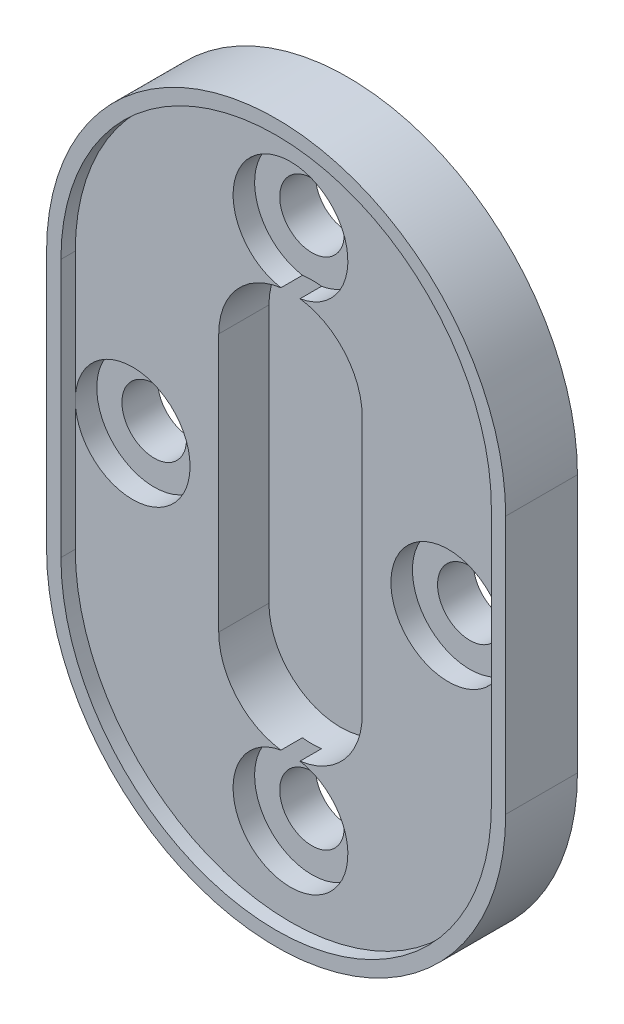
ISO-10303-21;
HEADER;
FILE_DESCRIPTION(('STEP AP214'),'2;1');
FILE_NAME('part.step','',(''),(''),'','','');
FILE_SCHEMA(('AUTOMOTIVE_DESIGN { 1 0 10303 214 1 1 1 1 }'));
ENDSEC;
DATA;
#1=APPLICATION_CONTEXT('core data for automotive mechanical design processes');
#2=APPLICATION_PROTOCOL_DEFINITION('international standard','automotive_design',2000,#1);
#3=PRODUCT_CONTEXT('',#1,'mechanical');
#4=PRODUCT('Part','Part','',(#3));
#5=PRODUCT_RELATED_PRODUCT_CATEGORY('part','',(#4));
#6=PRODUCT_DEFINITION_FORMATION('','',#4);
#7=PRODUCT_DEFINITION_CONTEXT('part definition',#1,'design');
#8=PRODUCT_DEFINITION('design','',#6,#7);
#9=PRODUCT_DEFINITION_SHAPE('','',#8);
#10=(LENGTH_UNIT() NAMED_UNIT(*) SI_UNIT(.MILLI.,.METRE.));
#11=(NAMED_UNIT(*) PLANE_ANGLE_UNIT() SI_UNIT($,.RADIAN.));
#12=(NAMED_UNIT(*) SI_UNIT($,.STERADIAN.) SOLID_ANGLE_UNIT());
#13=UNCERTAINTY_MEASURE_WITH_UNIT(LENGTH_MEASURE(1.E-05),#10,'distance_accuracy_value','');
#14=(GEOMETRIC_REPRESENTATION_CONTEXT(3) GLOBAL_UNCERTAINTY_ASSIGNED_CONTEXT((#13)) GLOBAL_UNIT_ASSIGNED_CONTEXT((#10,
#11,#12)) REPRESENTATION_CONTEXT('',''));
#15=CARTESIAN_POINT('',(0.,0.,0.));
#16=DIRECTION('',(0.,0.,1.));
#17=DIRECTION('',(1.,0.,0.));
#18=AXIS2_PLACEMENT_3D('',#15,#16,#17);
#19=CARTESIAN_POINT('',(0.,-9.,4.));
#20=DIRECTION('',(0.,0.,1.));
#21=DIRECTION('',(1.,0.,0.));
#22=AXIS2_PLACEMENT_3D('',#19,#20,#21);
#23=PLANE('',#22);
#24=CARTESIAN_POINT('',(0.,17.9,4.));
#25=DIRECTION('',(0.,0.,1.));
#26=DIRECTION('',(1.,0.,0.));
#27=AXIS2_PLACEMENT_3D('',#24,#25,#26);
#28=CIRCLE('',#27,4.);
#29=CARTESIAN_POINT('',(0.664718331927447,13.9556179775281,4.));
#30=VERTEX_POINT('',#29);
#31=CARTESIAN_POINT('',(-0.664718331927447,13.9556179775281,4.));
#32=VERTEX_POINT('',#31);
#33=EDGE_CURVE('E49',#30,#32,#28,.T.);
#34=ORIENTED_EDGE('',*,*,#33,.F.);
#35=CARTESIAN_POINT('',(0.,9.,4.));
#36=DIRECTION('',(0.,0.,1.));
#37=DIRECTION('',(1.,0.,0.));
#38=AXIS2_PLACEMENT_3D('',#35,#36,#37);
#39=CIRCLE('',#38,5.);
#40=CARTESIAN_POINT('',(5.,9.,4.));
#41=VERTEX_POINT('',#40);
#42=EDGE_CURVE('E177',#41,#30,#39,.T.);
#43=ORIENTED_EDGE('',*,*,#42,.F.);
#44=DIRECTION('',(0.,1.,0.));
#45=VECTOR('',#44,1.);
#46=CARTESIAN_POINT('',(5.,-9.,4.));
#47=LINE('',#46,#45);
#48=CARTESIAN_POINT('',(5.,-9.,4.));
#49=VERTEX_POINT('',#48);
#50=EDGE_CURVE('E178',#49,#41,#47,.T.);
#51=ORIENTED_EDGE('',*,*,#50,.F.);
#52=CARTESIAN_POINT('',(0.,-9.,4.));
#53=DIRECTION('',(0.,0.,1.));
#54=DIRECTION('',(1.,0.,0.));
#55=AXIS2_PLACEMENT_3D('',#52,#53,#54);
#56=CIRCLE('',#55,5.);
#57=CARTESIAN_POINT('',(0.664718331927449,-13.9556179775281,4.));
#58=VERTEX_POINT('',#57);
#59=EDGE_CURVE('E227',#58,#49,#56,.T.);
#60=ORIENTED_EDGE('',*,*,#59,.F.);
#61=CARTESIAN_POINT('',(0.,-17.9,4.));
#62=DIRECTION('',(0.,0.,1.));
#63=DIRECTION('',(1.,0.,0.));
#64=AXIS2_PLACEMENT_3D('',#61,#62,#63);
#65=CIRCLE('',#64,4.);
#66=CARTESIAN_POINT('',(-0.664718331927444,-13.9556179775281,4.));
#67=VERTEX_POINT('',#66);
#68=EDGE_CURVE('E233',#67,#58,#65,.T.);
#69=ORIENTED_EDGE('',*,*,#68,.F.);
#70=CARTESIAN_POINT('',(-5.,-9.,4.));
#71=VERTEX_POINT('',#70);
#72=EDGE_CURVE('E181',#71,#67,#56,.T.);
#73=ORIENTED_EDGE('',*,*,#72,.F.);
#74=DIRECTION('',(0.,-1.,0.));
#75=VECTOR('',#74,1.);
#76=CARTESIAN_POINT('',(-5.,-9.,4.));
#77=LINE('',#76,#75);
#78=CARTESIAN_POINT('',(-5.,9.,4.));
#79=VERTEX_POINT('',#78);
#80=EDGE_CURVE('E176',#79,#71,#77,.T.);
#81=ORIENTED_EDGE('',*,*,#80,.F.);
#82=EDGE_CURVE('E169',#32,#79,#39,.T.);
#83=ORIENTED_EDGE('',*,*,#82,.F.);
#84=EDGE_LOOP('',(#34,#43,#51,#60,#69,#73,#81,#83));
#85=FACE_BOUND('',#84,.T.);
#86=DIRECTION('',(0.,1.,0.));
#87=VECTOR('',#86,1.);
#88=CARTESIAN_POINT('',(15.,-9.,4.));
#89=LINE('',#88,#87);
#90=CARTESIAN_POINT('',(15.,-9.,4.));
#91=VERTEX_POINT('',#90);
#92=CARTESIAN_POINT('',(15.,0.,4.));
#93=VERTEX_POINT('',#92);
#94=EDGE_CURVE('E271',#91,#93,#89,.T.);
#95=ORIENTED_EDGE('',*,*,#94,.T.);
#96=CARTESIAN_POINT('',(11.,0.,4.));
#97=DIRECTION('',(0.,0.,1.));
#98=DIRECTION('',(1.,0.,0.));
#99=AXIS2_PLACEMENT_3D('',#96,#97,#98);
#100=CIRCLE('',#99,4.);
#101=EDGE_CURVE('E62',#93,#93,#100,.T.);
#102=ORIENTED_EDGE('',*,*,#101,.F.);
#103=CARTESIAN_POINT('',(15.,9.00000000000001,4.));
#104=VERTEX_POINT('',#103);
#105=EDGE_CURVE('E275',#93,#104,#89,.T.);
#106=ORIENTED_EDGE('',*,*,#105,.T.);
#107=CARTESIAN_POINT('',(0.,9.,4.));
#108=DIRECTION('',(0.,0.,1.));
#109=DIRECTION('',(1.,0.,0.));
#110=AXIS2_PLACEMENT_3D('',#107,#108,#109);
#111=CIRCLE('',#110,15.);
#112=CARTESIAN_POINT('',(-15.,9.,4.));
#113=VERTEX_POINT('',#112);
#114=EDGE_CURVE('E282',#104,#113,#111,.T.);
#115=ORIENTED_EDGE('',*,*,#114,.T.);
#116=DIRECTION('',(0.,-1.,0.));
#117=VECTOR('',#116,1.);
#118=CARTESIAN_POINT('',(-15.,9.,4.));
#119=LINE('',#118,#117);
#120=CARTESIAN_POINT('',(-15.,0.,4.));
#121=VERTEX_POINT('',#120);
#122=EDGE_CURVE('E278',#113,#121,#119,.T.);
#123=ORIENTED_EDGE('',*,*,#122,.T.);
#124=CARTESIAN_POINT('',(-11.,0.,4.));
#125=DIRECTION('',(0.,0.,1.));
#126=DIRECTION('',(1.,0.,0.));
#127=AXIS2_PLACEMENT_3D('',#124,#125,#126);
#128=CIRCLE('',#127,4.);
#129=EDGE_CURVE('E309',#121,#121,#128,.T.);
#130=ORIENTED_EDGE('',*,*,#129,.F.);
#131=CARTESIAN_POINT('',(-15.,-9.00000000000001,4.));
#132=VERTEX_POINT('',#131);
#133=EDGE_CURVE('E281',#121,#132,#119,.T.);
#134=ORIENTED_EDGE('',*,*,#133,.T.);
#135=CARTESIAN_POINT('',(0.,-9.,4.));
#136=DIRECTION('',(0.,0.,1.));
#137=DIRECTION('',(1.,0.,0.));
#138=AXIS2_PLACEMENT_3D('',#135,#136,#137);
#139=CIRCLE('',#138,15.);
#140=EDGE_CURVE('E276',#132,#91,#139,.T.);
#141=ORIENTED_EDGE('',*,*,#140,.T.);
#142=EDGE_LOOP('',(#95,#102,#106,#115,#123,#130,#134,#141));
#143=FACE_BOUND('',#142,.T.);
#144=ADVANCED_FACE('F41',(#85,#143),#23,.T.);
#145=CARTESIAN_POINT('',(0.,-9.,0.5));
#146=DIRECTION('',(0.,0.,1.));
#147=DIRECTION('',(1.,0.,0.));
#148=AXIS2_PLACEMENT_3D('',#145,#146,#147);
#149=CYLINDRICAL_SURFACE('',#148,5.);
#150=CARTESIAN_POINT('',(0.,-9.,2.5));
#151=DIRECTION('',(0.,0.,-1.));
#152=DIRECTION('',(-1.,0.,0.));
#153=AXIS2_PLACEMENT_3D('',#150,#151,#152);
#154=CIRCLE('',#153,5.);
#155=CARTESIAN_POINT('',(-0.664718331927444,-13.9556179775281,2.5));
#156=VERTEX_POINT('',#155);
#157=CARTESIAN_POINT('',(0.664718331927449,-13.9556179775281,2.5));
#158=VERTEX_POINT('',#157);
#159=EDGE_CURVE('E221',#156,#158,#154,.F.);
#160=ORIENTED_EDGE('',*,*,#159,.T.);
#161=DIRECTION('',(0.,0.,1.));
#162=VECTOR('',#161,1.);
#163=CARTESIAN_POINT('',(0.664718331927449,-13.9556179775281,3.25));
#164=LINE('',#163,#162);
#165=EDGE_CURVE('E165',#158,#58,#164,.T.);
#166=ORIENTED_EDGE('',*,*,#165,.T.);
#167=ORIENTED_EDGE('',*,*,#59,.T.);
#168=DIRECTION('',(0.,0.,1.));
#169=VECTOR('',#168,1.);
#170=CARTESIAN_POINT('',(5.,-9.,0.5));
#171=LINE('',#170,#169);
#172=CARTESIAN_POINT('',(5.,-9.,0.5));
#173=VERTEX_POINT('',#172);
#174=EDGE_CURVE('E194',#173,#49,#171,.T.);
#175=ORIENTED_EDGE('',*,*,#174,.F.);
#176=CARTESIAN_POINT('',(0.,-9.,0.5));
#177=DIRECTION('',(0.,0.,1.));
#178=DIRECTION('',(1.,0.,0.));
#179=AXIS2_PLACEMENT_3D('',#176,#177,#178);
#180=CIRCLE('',#179,5.);
#181=CARTESIAN_POINT('',(-5.,-9.,0.5));
#182=VERTEX_POINT('',#181);
#183=EDGE_CURVE('E186',#182,#173,#180,.T.);
#184=ORIENTED_EDGE('',*,*,#183,.F.);
#185=DIRECTION('',(0.,0.,1.));
#186=VECTOR('',#185,1.);
#187=CARTESIAN_POINT('',(-5.,-9.,0.5));
#188=LINE('',#187,#186);
#189=EDGE_CURVE('E187',#182,#71,#188,.T.);
#190=ORIENTED_EDGE('',*,*,#189,.T.);
#191=ORIENTED_EDGE('',*,*,#72,.T.);
#192=DIRECTION('',(0.,0.,1.));
#193=VECTOR('',#192,1.);
#194=CARTESIAN_POINT('',(-0.664718331927444,-13.9556179775281,3.25));
#195=LINE('',#194,#193);
#196=EDGE_CURVE('E218',#67,#156,#195,.F.);
#197=ORIENTED_EDGE('',*,*,#196,.T.);
#198=EDGE_LOOP('',(#160,#166,#167,#175,#184,#190,#191,#197));
#199=FACE_BOUND('',#198,.T.);
#200=ADVANCED_FACE('F226',(#199),#149,.F.);
#201=CARTESIAN_POINT('',(-5.,-9.,0.5));
#202=DIRECTION('',(-1.,0.,0.));
#203=DIRECTION('',(0.,-1.,0.));
#204=AXIS2_PLACEMENT_3D('',#201,#202,#203);
#205=PLANE('',#204);
#206=ORIENTED_EDGE('',*,*,#80,.T.);
#207=ORIENTED_EDGE('',*,*,#189,.F.);
#208=DIRECTION('',(0.,-1.,0.));
#209=VECTOR('',#208,1.);
#210=CARTESIAN_POINT('',(-5.,-9.,0.5));
#211=LINE('',#210,#209);
#212=CARTESIAN_POINT('',(-5.,9.,0.5));
#213=VERTEX_POINT('',#212);
#214=EDGE_CURVE('E197',#213,#182,#211,.T.);
#215=ORIENTED_EDGE('',*,*,#214,.F.);
#216=DIRECTION('',(0.,0.,1.));
#217=VECTOR('',#216,1.);
#218=CARTESIAN_POINT('',(-5.,9.,0.5));
#219=LINE('',#218,#217);
#220=EDGE_CURVE('E190',#213,#79,#219,.T.);
#221=ORIENTED_EDGE('',*,*,#220,.T.);
#222=EDGE_LOOP('',(#206,#207,#215,#221));
#223=FACE_BOUND('',#222,.T.);
#224=ADVANCED_FACE('F340',(#223),#205,.F.);
#225=CARTESIAN_POINT('',(0.,9.,0.5));
#226=DIRECTION('',(0.,0.,1.));
#227=DIRECTION('',(1.,0.,0.));
#228=AXIS2_PLACEMENT_3D('',#225,#226,#227);
#229=CYLINDRICAL_SURFACE('',#228,5.);
#230=CARTESIAN_POINT('',(0.,9.,2.5));
#231=DIRECTION('',(0.,0.,-1.));
#232=DIRECTION('',(-1.,0.,0.));
#233=AXIS2_PLACEMENT_3D('',#230,#231,#232);
#234=CIRCLE('',#233,5.);
#235=CARTESIAN_POINT('',(0.664718331927446,13.9556179775281,2.5));
#236=VERTEX_POINT('',#235);
#237=CARTESIAN_POINT('',(-0.664718331927448,13.9556179775281,2.5));
#238=VERTEX_POINT('',#237);
#239=EDGE_CURVE('E11',#236,#238,#234,.F.);
#240=ORIENTED_EDGE('',*,*,#239,.T.);
#241=DIRECTION('',(0.,0.,1.));
#242=VECTOR('',#241,1.);
#243=CARTESIAN_POINT('',(-0.664718331927447,13.9556179775281,3.25));
#244=LINE('',#243,#242);
#245=EDGE_CURVE('E159',#238,#32,#244,.T.);
#246=ORIENTED_EDGE('',*,*,#245,.T.);
#247=ORIENTED_EDGE('',*,*,#82,.T.);
#248=ORIENTED_EDGE('',*,*,#220,.F.);
#249=CARTESIAN_POINT('',(0.,9.,0.5));
#250=DIRECTION('',(0.,0.,1.));
#251=DIRECTION('',(1.,0.,0.));
#252=AXIS2_PLACEMENT_3D('',#249,#250,#251);
#253=CIRCLE('',#252,5.);
#254=CARTESIAN_POINT('',(5.,9.,0.5));
#255=VERTEX_POINT('',#254);
#256=EDGE_CURVE('E242',#255,#213,#253,.T.);
#257=ORIENTED_EDGE('',*,*,#256,.F.);
#258=DIRECTION('',(0.,0.,1.));
#259=VECTOR('',#258,1.);
#260=CARTESIAN_POINT('',(5.,9.,0.5));
#261=LINE('',#260,#259);
#262=EDGE_CURVE('E192',#255,#41,#261,.T.);
#263=ORIENTED_EDGE('',*,*,#262,.T.);
#264=ORIENTED_EDGE('',*,*,#42,.T.);
#265=DIRECTION('',(0.,0.,1.));
#266=VECTOR('',#265,1.);
#267=CARTESIAN_POINT('',(0.664718331927447,13.9556179775281,3.25));
#268=LINE('',#267,#266);
#269=EDGE_CURVE('E56',#30,#236,#268,.F.);
#270=ORIENTED_EDGE('',*,*,#269,.T.);
#271=EDGE_LOOP('',(#240,#246,#247,#248,#257,#263,#264,#270));
#272=FACE_BOUND('',#271,.T.);
#273=ADVANCED_FACE('F168',(#272),#229,.F.);
#274=CARTESIAN_POINT('',(5.,-9.,0.5));
#275=DIRECTION('',(1.,0.,0.));
#276=DIRECTION('',(0.,1.,0.));
#277=AXIS2_PLACEMENT_3D('',#274,#275,#276);
#278=PLANE('',#277);
#279=ORIENTED_EDGE('',*,*,#50,.T.);
#280=ORIENTED_EDGE('',*,*,#262,.F.);
#281=DIRECTION('',(0.,1.,0.));
#282=VECTOR('',#281,1.);
#283=CARTESIAN_POINT('',(5.,-9.,0.5));
#284=LINE('',#283,#282);
#285=EDGE_CURVE('E245',#173,#255,#284,.T.);
#286=ORIENTED_EDGE('',*,*,#285,.F.);
#287=ORIENTED_EDGE('',*,*,#174,.T.);
#288=EDGE_LOOP('',(#279,#280,#286,#287));
#289=FACE_BOUND('',#288,.T.);
#290=ADVANCED_FACE('F334',(#289),#278,.F.);
#291=CARTESIAN_POINT('',(0.,-9.,0.5));
#292=DIRECTION('',(0.,0.,1.));
#293=DIRECTION('',(1.,0.,0.));
#294=AXIS2_PLACEMENT_3D('',#291,#292,#293);
#295=PLANE('',#294);
#296=ORIENTED_EDGE('',*,*,#183,.T.);
#297=ORIENTED_EDGE('',*,*,#285,.T.);
#298=ORIENTED_EDGE('',*,*,#256,.T.);
#299=ORIENTED_EDGE('',*,*,#214,.T.);
#300=EDGE_LOOP('',(#296,#297,#298,#299));
#301=FACE_BOUND('',#300,.T.);
#302=ADVANCED_FACE('F338',(#301),#295,.T.);
#303=CARTESIAN_POINT('',(0.,-9.,5.));
#304=DIRECTION('',(0.,0.,1.));
#305=DIRECTION('',(1.,0.,0.));
#306=AXIS2_PLACEMENT_3D('',#303,#304,#305);
#307=PLANE('',#306);
#308=CARTESIAN_POINT('',(0.,-9.,5.));
#309=DIRECTION('',(0.,0.,1.));
#310=DIRECTION('',(1.,0.,0.));
#311=AXIS2_PLACEMENT_3D('',#308,#309,#310);
#312=CIRCLE('',#311,16.);
#313=CARTESIAN_POINT('',(-16.,-9.00000000000001,5.));
#314=VERTEX_POINT('',#313);
#315=CARTESIAN_POINT('',(16.,-9.00000000000001,5.));
#316=VERTEX_POINT('',#315);
#317=EDGE_CURVE('E255',#314,#316,#312,.T.);
#318=ORIENTED_EDGE('',*,*,#317,.T.);
#319=DIRECTION('',(0.,1.,0.));
#320=VECTOR('',#319,1.);
#321=CARTESIAN_POINT('',(16.,-9.00000000000001,5.));
#322=LINE('',#321,#320);
#323=CARTESIAN_POINT('',(16.,9.00000000000001,5.));
#324=VERTEX_POINT('',#323);
#325=EDGE_CURVE('E252',#316,#324,#322,.T.);
#326=ORIENTED_EDGE('',*,*,#325,.T.);
#327=CARTESIAN_POINT('',(0.,9.,5.));
#328=DIRECTION('',(0.,0.,1.));
#329=DIRECTION('',(1.,0.,0.));
#330=AXIS2_PLACEMENT_3D('',#327,#328,#329);
#331=CIRCLE('',#330,16.);
#332=CARTESIAN_POINT('',(-16.,9.,5.));
#333=VERTEX_POINT('',#332);
#334=EDGE_CURVE('E237',#324,#333,#331,.T.);
#335=ORIENTED_EDGE('',*,*,#334,.T.);
#336=DIRECTION('',(0.,-1.,0.));
#337=VECTOR('',#336,1.);
#338=CARTESIAN_POINT('',(-16.,9.,5.));
#339=LINE('',#338,#337);
#340=EDGE_CURVE('E235',#333,#314,#339,.T.);
#341=ORIENTED_EDGE('',*,*,#340,.T.);
#342=EDGE_LOOP('',(#318,#326,#335,#341));
#343=FACE_BOUND('',#342,.T.);
#344=DIRECTION('',(0.,-1.,0.));
#345=VECTOR('',#344,1.);
#346=CARTESIAN_POINT('',(-15.,9.,5.));
#347=LINE('',#346,#345);
#348=CARTESIAN_POINT('',(-15.,9.,5.));
#349=VERTEX_POINT('',#348);
#350=CARTESIAN_POINT('',(-15.,-9.00000000000001,5.));
#351=VERTEX_POINT('',#350);
#352=EDGE_CURVE('E289',#349,#351,#347,.T.);
#353=ORIENTED_EDGE('',*,*,#352,.F.);
#354=CARTESIAN_POINT('',(0.,9.,5.));
#355=DIRECTION('',(0.,0.,1.));
#356=DIRECTION('',(1.,0.,0.));
#357=AXIS2_PLACEMENT_3D('',#354,#355,#356);
#358=CIRCLE('',#357,15.);
#359=CARTESIAN_POINT('',(15.,9.00000000000001,5.));
#360=VERTEX_POINT('',#359);
#361=EDGE_CURVE('E274',#360,#349,#358,.T.);
#362=ORIENTED_EDGE('',*,*,#361,.F.);
#363=DIRECTION('',(0.,1.,0.));
#364=VECTOR('',#363,1.);
#365=CARTESIAN_POINT('',(15.,-9.,5.));
#366=LINE('',#365,#364);
#367=CARTESIAN_POINT('',(15.,-9.,5.));
#368=VERTEX_POINT('',#367);
#369=EDGE_CURVE('E270',#368,#360,#366,.T.);
#370=ORIENTED_EDGE('',*,*,#369,.F.);
#371=CARTESIAN_POINT('',(0.,-9.,5.));
#372=DIRECTION('',(0.,0.,1.));
#373=DIRECTION('',(1.,0.,0.));
#374=AXIS2_PLACEMENT_3D('',#371,#372,#373);
#375=CIRCLE('',#374,15.);
#376=EDGE_CURVE('E286',#351,#368,#375,.T.);
#377=ORIENTED_EDGE('',*,*,#376,.F.);
#378=EDGE_LOOP('',(#353,#362,#370,#377));
#379=FACE_BOUND('',#378,.T.);
#380=ADVANCED_FACE('F391',(#343,#379),#307,.T.);
#381=CARTESIAN_POINT('',(0.,9.,5.));
#382=DIRECTION('',(0.,0.,-1.));
#383=DIRECTION('',(-1.,0.,0.));
#384=AXIS2_PLACEMENT_3D('',#381,#382,#383);
#385=CYLINDRICAL_SURFACE('',#384,15.);
#386=ORIENTED_EDGE('',*,*,#114,.F.);
#387=DIRECTION('',(0.,0.,-1.));
#388=VECTOR('',#387,1.);
#389=CARTESIAN_POINT('',(15.,9.00000000000001,5.));
#390=LINE('',#389,#388);
#391=EDGE_CURVE('E267',#360,#104,#390,.T.);
#392=ORIENTED_EDGE('',*,*,#391,.F.);
#393=ORIENTED_EDGE('',*,*,#361,.T.);
#394=DIRECTION('',(0.,0.,-1.));
#395=VECTOR('',#394,1.);
#396=CARTESIAN_POINT('',(-15.,9.,5.));
#397=LINE('',#396,#395);
#398=EDGE_CURVE('E258',#349,#113,#397,.T.);
#399=ORIENTED_EDGE('',*,*,#398,.T.);
#400=EDGE_LOOP('',(#386,#392,#393,#399));
#401=FACE_BOUND('',#400,.T.);
#402=ADVANCED_FACE('F394',(#401),#385,.F.);
#403=CARTESIAN_POINT('',(-15.,9.,5.));
#404=DIRECTION('',(1.,0.,0.));
#405=DIRECTION('',(0.,1.,0.));
#406=AXIS2_PLACEMENT_3D('',#403,#404,#405);
#407=PLANE('',#406);
#408=ORIENTED_EDGE('',*,*,#122,.F.);
#409=ORIENTED_EDGE('',*,*,#398,.F.);
#410=ORIENTED_EDGE('',*,*,#352,.T.);
#411=DIRECTION('',(0.,0.,-1.));
#412=VECTOR('',#411,1.);
#413=CARTESIAN_POINT('',(-15.,-9.00000000000001,5.));
#414=LINE('',#413,#412);
#415=EDGE_CURVE('E261',#351,#132,#414,.T.);
#416=ORIENTED_EDGE('',*,*,#415,.T.);
#417=ORIENTED_EDGE('',*,*,#133,.F.);
#418=EDGE_LOOP('',(#408,#409,#410,#416,#417));
#419=FACE_BOUND('',#418,.T.);
#420=ADVANCED_FACE('F404',(#419),#407,.T.);
#421=CARTESIAN_POINT('',(0.,-9.,5.));
#422=DIRECTION('',(0.,0.,-1.));
#423=DIRECTION('',(-1.,0.,0.));
#424=AXIS2_PLACEMENT_3D('',#421,#422,#423);
#425=CYLINDRICAL_SURFACE('',#424,15.);
#426=ORIENTED_EDGE('',*,*,#140,.F.);
#427=ORIENTED_EDGE('',*,*,#415,.F.);
#428=ORIENTED_EDGE('',*,*,#376,.T.);
#429=DIRECTION('',(0.,0.,-1.));
#430=VECTOR('',#429,1.);
#431=CARTESIAN_POINT('',(15.,-9.,5.));
#432=LINE('',#431,#430);
#433=EDGE_CURVE('E264',#368,#91,#432,.T.);
#434=ORIENTED_EDGE('',*,*,#433,.T.);
#435=EDGE_LOOP('',(#426,#427,#428,#434));
#436=FACE_BOUND('',#435,.T.);
#437=ADVANCED_FACE('F408',(#436),#425,.F.);
#438=CARTESIAN_POINT('',(15.,-9.,5.));
#439=DIRECTION('',(-1.,0.,0.));
#440=DIRECTION('',(0.,-1.,0.));
#441=AXIS2_PLACEMENT_3D('',#438,#439,#440);
#442=PLANE('',#441);
#443=ORIENTED_EDGE('',*,*,#94,.F.);
#444=ORIENTED_EDGE('',*,*,#433,.F.);
#445=ORIENTED_EDGE('',*,*,#369,.T.);
#446=ORIENTED_EDGE('',*,*,#391,.T.);
#447=ORIENTED_EDGE('',*,*,#105,.F.);
#448=EDGE_LOOP('',(#443,#444,#445,#446,#447));
#449=FACE_BOUND('',#448,.T.);
#450=ADVANCED_FACE('F370',(#449),#442,.T.);
#451=CARTESIAN_POINT('',(0.,-9.,0.));
#452=DIRECTION('',(0.,0.,1.));
#453=DIRECTION('',(1.,0.,0.));
#454=AXIS2_PLACEMENT_3D('',#451,#452,#453);
#455=PLANE('',#454);
#456=CARTESIAN_POINT('',(0.,17.9,0.));
#457=DIRECTION('',(0.,0.,1.));
#458=DIRECTION('',(1.,0.,0.));
#459=AXIS2_PLACEMENT_3D('',#456,#457,#458);
#460=CIRCLE('',#459,2.25);
#461=CARTESIAN_POINT('',(2.25,17.9,0.));
#462=VERTEX_POINT('',#461);
#463=EDGE_CURVE('E322',#462,#462,#460,.T.);
#464=ORIENTED_EDGE('',*,*,#463,.T.);
#465=EDGE_LOOP('',(#464));
#466=FACE_BOUND('',#465,.T.);
#467=CARTESIAN_POINT('',(11.,0.,0.));
#468=DIRECTION('',(0.,0.,1.));
#469=DIRECTION('',(1.,0.,0.));
#470=AXIS2_PLACEMENT_3D('',#467,#468,#469);
#471=CIRCLE('',#470,2.25);
#472=CARTESIAN_POINT('',(13.25,0.,0.));
#473=VERTEX_POINT('',#472);
#474=EDGE_CURVE('E311',#473,#473,#471,.T.);
#475=ORIENTED_EDGE('',*,*,#474,.T.);
#476=EDGE_LOOP('',(#475));
#477=FACE_BOUND('',#476,.T.);
#478=CARTESIAN_POINT('',(-11.,0.,0.));
#479=DIRECTION('',(0.,0.,1.));
#480=DIRECTION('',(1.,0.,0.));
#481=AXIS2_PLACEMENT_3D('',#478,#479,#480);
#482=CIRCLE('',#481,2.25);
#483=CARTESIAN_POINT('',(-8.75,0.,0.));
#484=VERTEX_POINT('',#483);
#485=EDGE_CURVE('E300',#484,#484,#482,.T.);
#486=ORIENTED_EDGE('',*,*,#485,.T.);
#487=EDGE_LOOP('',(#486));
#488=FACE_BOUND('',#487,.T.);
#489=CARTESIAN_POINT('',(0.,-17.9,0.));
#490=DIRECTION('',(0.,0.,1.));
#491=DIRECTION('',(1.,0.,0.));
#492=AXIS2_PLACEMENT_3D('',#489,#490,#491);
#493=CIRCLE('',#492,2.25);
#494=CARTESIAN_POINT('',(2.25,-17.9,0.));
#495=VERTEX_POINT('',#494);
#496=EDGE_CURVE('E284',#495,#495,#493,.T.);
#497=ORIENTED_EDGE('',*,*,#496,.T.);
#498=EDGE_LOOP('',(#497));
#499=FACE_BOUND('',#498,.T.);
#500=CARTESIAN_POINT('',(0.,-9.,0.));
#501=DIRECTION('',(0.,0.,1.));
#502=DIRECTION('',(1.,0.,0.));
#503=AXIS2_PLACEMENT_3D('',#500,#501,#502);
#504=CIRCLE('',#503,16.);
#505=CARTESIAN_POINT('',(-16.,-9.00000000000001,0.));
#506=VERTEX_POINT('',#505);
#507=CARTESIAN_POINT('',(16.,-9.00000000000001,0.));
#508=VERTEX_POINT('',#507);
#509=EDGE_CURVE('E189',#506,#508,#504,.T.);
#510=ORIENTED_EDGE('',*,*,#509,.F.);
#511=DIRECTION('',(0.,-1.,0.));
#512=VECTOR('',#511,1.);
#513=CARTESIAN_POINT('',(-16.,-9.00000000000001,0.));
#514=LINE('',#513,#512);
#515=CARTESIAN_POINT('',(-16.,9.,0.));
#516=VERTEX_POINT('',#515);
#517=EDGE_CURVE('E204',#516,#506,#514,.T.);
#518=ORIENTED_EDGE('',*,*,#517,.F.);
#519=CARTESIAN_POINT('',(0.,9.,0.));
#520=DIRECTION('',(0.,0.,1.));
#521=DIRECTION('',(1.,0.,0.));
#522=AXIS2_PLACEMENT_3D('',#519,#520,#521);
#523=CIRCLE('',#522,16.);
#524=CARTESIAN_POINT('',(16.,9.00000000000001,0.));
#525=VERTEX_POINT('',#524);
#526=EDGE_CURVE('E202',#525,#516,#523,.T.);
#527=ORIENTED_EDGE('',*,*,#526,.F.);
#528=DIRECTION('',(0.,1.,0.));
#529=VECTOR('',#528,1.);
#530=CARTESIAN_POINT('',(16.,-9.00000000000001,0.));
#531=LINE('',#530,#529);
#532=EDGE_CURVE('E200',#508,#525,#531,.T.);
#533=ORIENTED_EDGE('',*,*,#532,.F.);
#534=EDGE_LOOP('',(#510,#518,#527,#533));
#535=FACE_BOUND('',#534,.T.);
#536=ADVANCED_FACE('F366',(#466,#477,#488,#499,#535),#455,.F.);
#537=CARTESIAN_POINT('',(-16.,-9.00000000000001,4.));
#538=DIRECTION('',(1.,0.,0.));
#539=DIRECTION('',(0.,1.,0.));
#540=AXIS2_PLACEMENT_3D('',#537,#538,#539);
#541=PLANE('',#540);
#542=ORIENTED_EDGE('',*,*,#517,.T.);
#543=DIRECTION('',(0.,0.,-1.));
#544=VECTOR('',#543,1.);
#545=CARTESIAN_POINT('',(-16.,-9.00000000000001,4.));
#546=LINE('',#545,#544);
#547=EDGE_CURVE('E206',#314,#506,#546,.T.);
#548=ORIENTED_EDGE('',*,*,#547,.F.);
#549=ORIENTED_EDGE('',*,*,#340,.F.);
#550=DIRECTION('',(0.,0.,-1.));
#551=VECTOR('',#550,1.);
#552=CARTESIAN_POINT('',(-16.,9.,4.));
#553=LINE('',#552,#551);
#554=EDGE_CURVE('E209',#333,#516,#553,.T.);
#555=ORIENTED_EDGE('',*,*,#554,.T.);
#556=EDGE_LOOP('',(#542,#548,#549,#555));
#557=FACE_BOUND('',#556,.T.);
#558=ADVANCED_FACE('F369',(#557),#541,.F.);
#559=CARTESIAN_POINT('',(0.,9.,4.));
#560=DIRECTION('',(0.,0.,-1.));
#561=DIRECTION('',(-1.,0.,0.));
#562=AXIS2_PLACEMENT_3D('',#559,#560,#561);
#563=CYLINDRICAL_SURFACE('',#562,16.);
#564=ORIENTED_EDGE('',*,*,#526,.T.);
#565=ORIENTED_EDGE('',*,*,#554,.F.);
#566=ORIENTED_EDGE('',*,*,#334,.F.);
#567=DIRECTION('',(0.,0.,-1.));
#568=VECTOR('',#567,1.);
#569=CARTESIAN_POINT('',(16.,9.00000000000001,4.));
#570=LINE('',#569,#568);
#571=EDGE_CURVE('E212',#324,#525,#570,.T.);
#572=ORIENTED_EDGE('',*,*,#571,.T.);
#573=EDGE_LOOP('',(#564,#565,#566,#572));
#574=FACE_BOUND('',#573,.T.);
#575=ADVANCED_FACE('F374',(#574),#563,.T.);
#576=CARTESIAN_POINT('',(16.,-9.00000000000001,4.));
#577=DIRECTION('',(-1.,0.,0.));
#578=DIRECTION('',(0.,-1.,0.));
#579=AXIS2_PLACEMENT_3D('',#576,#577,#578);
#580=PLANE('',#579);
#581=ORIENTED_EDGE('',*,*,#532,.T.);
#582=ORIENTED_EDGE('',*,*,#571,.F.);
#583=ORIENTED_EDGE('',*,*,#325,.F.);
#584=DIRECTION('',(0.,0.,-1.));
#585=VECTOR('',#584,1.);
#586=CARTESIAN_POINT('',(16.,-9.00000000000001,4.));
#587=LINE('',#586,#585);
#588=EDGE_CURVE('E215',#316,#508,#587,.T.);
#589=ORIENTED_EDGE('',*,*,#588,.T.);
#590=EDGE_LOOP('',(#581,#582,#583,#589));
#591=FACE_BOUND('',#590,.T.);
#592=ADVANCED_FACE('F354',(#591),#580,.F.);
#593=CARTESIAN_POINT('',(0.,-9.,4.));
#594=DIRECTION('',(0.,0.,-1.));
#595=DIRECTION('',(-1.,0.,0.));
#596=AXIS2_PLACEMENT_3D('',#593,#594,#595);
#597=CYLINDRICAL_SURFACE('',#596,16.);
#598=ORIENTED_EDGE('',*,*,#509,.T.);
#599=ORIENTED_EDGE('',*,*,#588,.F.);
#600=ORIENTED_EDGE('',*,*,#317,.F.);
#601=ORIENTED_EDGE('',*,*,#547,.T.);
#602=EDGE_LOOP('',(#598,#599,#600,#601));
#603=FACE_BOUND('',#602,.T.);
#604=ADVANCED_FACE('F43',(#603),#597,.T.);
#605=CARTESIAN_POINT('',(2.25,-17.9,2.5));
#606=DIRECTION('',(0.,0.,-1.));
#607=DIRECTION('',(-1.,0.,0.));
#608=AXIS2_PLACEMENT_3D('',#605,#606,#607);
#609=PLANE('',#608);
#610=CARTESIAN_POINT('',(0.,-17.9,2.5));
#611=DIRECTION('',(0.,0.,1.));
#612=DIRECTION('',(1.,0.,0.));
#613=AXIS2_PLACEMENT_3D('',#610,#611,#612);
#614=CIRCLE('',#613,2.25);
#615=CARTESIAN_POINT('',(2.25,-17.9,2.5));
#616=VERTEX_POINT('',#615);
#617=EDGE_CURVE('E294',#616,#616,#614,.T.);
#618=ORIENTED_EDGE('',*,*,#617,.F.);
#619=EDGE_LOOP('',(#618));
#620=FACE_BOUND('',#619,.T.);
#621=CARTESIAN_POINT('',(0.,-17.9,2.5));
#622=DIRECTION('',(0.,0.,1.));
#623=DIRECTION('',(1.,0.,0.));
#624=AXIS2_PLACEMENT_3D('',#621,#622,#623);
#625=CIRCLE('',#624,4.);
#626=EDGE_CURVE('E297',#156,#158,#625,.T.);
#627=ORIENTED_EDGE('',*,*,#626,.T.);
#628=ORIENTED_EDGE('',*,*,#159,.F.);
#629=EDGE_LOOP('',(#627,#628));
#630=FACE_BOUND('',#629,.T.);
#631=ADVANCED_FACE('F343',(#620,#630),#609,.F.);
#632=CARTESIAN_POINT('',(0.,-17.9,4.));
#633=DIRECTION('',(0.,0.,1.));
#634=DIRECTION('',(1.,0.,0.));
#635=AXIS2_PLACEMENT_3D('',#632,#633,#634);
#636=CYLINDRICAL_SURFACE('',#635,4.);
#637=ORIENTED_EDGE('',*,*,#626,.F.);
#638=ORIENTED_EDGE('',*,*,#196,.F.);
#639=ORIENTED_EDGE('',*,*,#68,.T.);
#640=ORIENTED_EDGE('',*,*,#165,.F.);
#641=EDGE_LOOP('',(#637,#638,#639,#640));
#642=FACE_BOUND('',#641,.T.);
#643=ADVANCED_FACE('F341',(#642),#636,.F.);
#644=CARTESIAN_POINT('',(0.,-17.9,4.));
#645=DIRECTION('',(0.,0.,1.));
#646=DIRECTION('',(1.,0.,0.));
#647=AXIS2_PLACEMENT_3D('',#644,#645,#646);
#648=CYLINDRICAL_SURFACE('',#647,2.25);
#649=ORIENTED_EDGE('',*,*,#496,.F.);
#650=EDGE_LOOP('',(#649));
#651=FACE_BOUND('',#650,.T.);
#652=ORIENTED_EDGE('',*,*,#617,.T.);
#653=EDGE_LOOP('',(#652));
#654=FACE_BOUND('',#653,.T.);
#655=ADVANCED_FACE('F351',(#651,#654),#648,.F.);
#656=CARTESIAN_POINT('',(-11.,0.,4.));
#657=DIRECTION('',(0.,0.,1.));
#658=DIRECTION('',(1.,0.,0.));
#659=AXIS2_PLACEMENT_3D('',#656,#657,#658);
#660=CYLINDRICAL_SURFACE('',#659,2.25);
#661=ORIENTED_EDGE('',*,*,#485,.F.);
#662=EDGE_LOOP('',(#661));
#663=FACE_BOUND('',#662,.T.);
#664=CARTESIAN_POINT('',(-11.,0.,2.5));
#665=DIRECTION('',(0.,0.,1.));
#666=DIRECTION('',(1.,0.,0.));
#667=AXIS2_PLACEMENT_3D('',#664,#665,#666);
#668=CIRCLE('',#667,2.25);
#669=CARTESIAN_POINT('',(-8.75,0.,2.5));
#670=VERTEX_POINT('',#669);
#671=EDGE_CURVE('E303',#670,#670,#668,.T.);
#672=ORIENTED_EDGE('',*,*,#671,.T.);
#673=EDGE_LOOP('',(#672));
#674=FACE_BOUND('',#673,.T.);
#675=ADVANCED_FACE('F577',(#663,#674),#660,.F.);
#676=CARTESIAN_POINT('',(-8.75,0.,2.5));
#677=DIRECTION('',(0.,0.,-1.));
#678=DIRECTION('',(-1.,0.,0.));
#679=AXIS2_PLACEMENT_3D('',#676,#677,#678);
#680=PLANE('',#679);
#681=ORIENTED_EDGE('',*,*,#671,.F.);
#682=EDGE_LOOP('',(#681));
#683=FACE_BOUND('',#682,.T.);
#684=CARTESIAN_POINT('',(-11.,0.,2.5));
#685=DIRECTION('',(0.,0.,1.));
#686=DIRECTION('',(1.,0.,0.));
#687=AXIS2_PLACEMENT_3D('',#684,#685,#686);
#688=CIRCLE('',#687,4.);
#689=CARTESIAN_POINT('',(-7.,0.,2.5));
#690=VERTEX_POINT('',#689);
#691=EDGE_CURVE('E306',#690,#690,#688,.T.);
#692=ORIENTED_EDGE('',*,*,#691,.T.);
#693=EDGE_LOOP('',(#692));
#694=FACE_BOUND('',#693,.T.);
#695=ADVANCED_FACE('F584',(#683,#694),#680,.F.);
#696=CARTESIAN_POINT('',(-11.,0.,4.));
#697=DIRECTION('',(0.,0.,1.));
#698=DIRECTION('',(1.,0.,0.));
#699=AXIS2_PLACEMENT_3D('',#696,#697,#698);
#700=CYLINDRICAL_SURFACE('',#699,4.);
#701=ORIENTED_EDGE('',*,*,#691,.F.);
#702=EDGE_LOOP('',(#701));
#703=FACE_BOUND('',#702,.T.);
#704=ORIENTED_EDGE('',*,*,#129,.T.);
#705=EDGE_LOOP('',(#704));
#706=FACE_BOUND('',#705,.T.);
#707=ADVANCED_FACE('F592',(#703,#706),#700,.F.);
#708=CARTESIAN_POINT('',(11.,0.,4.));
#709=DIRECTION('',(0.,0.,1.));
#710=DIRECTION('',(1.,0.,0.));
#711=AXIS2_PLACEMENT_3D('',#708,#709,#710);
#712=CYLINDRICAL_SURFACE('',#711,2.25);
#713=ORIENTED_EDGE('',*,*,#474,.F.);
#714=EDGE_LOOP('',(#713));
#715=FACE_BOUND('',#714,.T.);
#716=CARTESIAN_POINT('',(11.,0.,2.5));
#717=DIRECTION('',(0.,0.,1.));
#718=DIRECTION('',(1.,0.,0.));
#719=AXIS2_PLACEMENT_3D('',#716,#717,#718);
#720=CIRCLE('',#719,2.25);
#721=CARTESIAN_POINT('',(13.25,0.,2.5));
#722=VERTEX_POINT('',#721);
#723=EDGE_CURVE('E314',#722,#722,#720,.T.);
#724=ORIENTED_EDGE('',*,*,#723,.T.);
#725=EDGE_LOOP('',(#724));
#726=FACE_BOUND('',#725,.T.);
#727=ADVANCED_FACE('F600',(#715,#726),#712,.F.);
#728=CARTESIAN_POINT('',(13.25,0.,2.5));
#729=DIRECTION('',(0.,0.,-1.));
#730=DIRECTION('',(-1.,0.,0.));
#731=AXIS2_PLACEMENT_3D('',#728,#729,#730);
#732=PLANE('',#731);
#733=ORIENTED_EDGE('',*,*,#723,.F.);
#734=EDGE_LOOP('',(#733));
#735=FACE_BOUND('',#734,.T.);
#736=CARTESIAN_POINT('',(11.,0.,2.5));
#737=DIRECTION('',(0.,0.,1.));
#738=DIRECTION('',(1.,0.,0.));
#739=AXIS2_PLACEMENT_3D('',#736,#737,#738);
#740=CIRCLE('',#739,4.);
#741=CARTESIAN_POINT('',(15.,0.,2.5));
#742=VERTEX_POINT('',#741);
#743=EDGE_CURVE('E317',#742,#742,#740,.T.);
#744=ORIENTED_EDGE('',*,*,#743,.T.);
#745=EDGE_LOOP('',(#744));
#746=FACE_BOUND('',#745,.T.);
#747=ADVANCED_FACE('F608',(#735,#746),#732,.F.);
#748=CARTESIAN_POINT('',(11.,0.,4.));
#749=DIRECTION('',(0.,0.,1.));
#750=DIRECTION('',(1.,0.,0.));
#751=AXIS2_PLACEMENT_3D('',#748,#749,#750);
#752=CYLINDRICAL_SURFACE('',#751,4.);
#753=ORIENTED_EDGE('',*,*,#743,.F.);
#754=EDGE_LOOP('',(#753));
#755=FACE_BOUND('',#754,.T.);
#756=ORIENTED_EDGE('',*,*,#101,.T.);
#757=EDGE_LOOP('',(#756));
#758=FACE_BOUND('',#757,.T.);
#759=ADVANCED_FACE('F616',(#755,#758),#752,.F.);
#760=CARTESIAN_POINT('',(2.25,17.9,2.5));
#761=DIRECTION('',(0.,0.,-1.));
#762=DIRECTION('',(-1.,0.,0.));
#763=AXIS2_PLACEMENT_3D('',#760,#761,#762);
#764=PLANE('',#763);
#765=CARTESIAN_POINT('',(0.,17.9,2.5));
#766=DIRECTION('',(0.,0.,1.));
#767=DIRECTION('',(1.,0.,0.));
#768=AXIS2_PLACEMENT_3D('',#765,#766,#767);
#769=CIRCLE('',#768,2.25);
#770=CARTESIAN_POINT('',(2.25,17.9,2.5));
#771=VERTEX_POINT('',#770);
#772=EDGE_CURVE('E325',#771,#771,#769,.T.);
#773=ORIENTED_EDGE('',*,*,#772,.F.);
#774=EDGE_LOOP('',(#773));
#775=FACE_BOUND('',#774,.T.);
#776=CARTESIAN_POINT('',(0.,17.9,2.5));
#777=DIRECTION('',(0.,0.,1.));
#778=DIRECTION('',(1.,0.,0.));
#779=AXIS2_PLACEMENT_3D('',#776,#777,#778);
#780=CIRCLE('',#779,4.);
#781=EDGE_CURVE('E328',#236,#238,#780,.T.);
#782=ORIENTED_EDGE('',*,*,#781,.T.);
#783=ORIENTED_EDGE('',*,*,#239,.F.);
#784=EDGE_LOOP('',(#782,#783));
#785=FACE_BOUND('',#784,.T.);
#786=ADVANCED_FACE('F330',(#775,#785),#764,.F.);
#787=CARTESIAN_POINT('',(0.,17.9,4.));
#788=DIRECTION('',(0.,0.,1.));
#789=DIRECTION('',(1.,0.,0.));
#790=AXIS2_PLACEMENT_3D('',#787,#788,#789);
#791=CYLINDRICAL_SURFACE('',#790,4.);
#792=ORIENTED_EDGE('',*,*,#781,.F.);
#793=ORIENTED_EDGE('',*,*,#269,.F.);
#794=ORIENTED_EDGE('',*,*,#33,.T.);
#795=ORIENTED_EDGE('',*,*,#245,.F.);
#796=EDGE_LOOP('',(#792,#793,#794,#795));
#797=FACE_BOUND('',#796,.T.);
#798=ADVANCED_FACE('F158',(#797),#791,.F.);
#799=CARTESIAN_POINT('',(0.,17.9,4.));
#800=DIRECTION('',(0.,0.,1.));
#801=DIRECTION('',(1.,0.,0.));
#802=AXIS2_PLACEMENT_3D('',#799,#800,#801);
#803=CYLINDRICAL_SURFACE('',#802,2.25);
#804=ORIENTED_EDGE('',*,*,#463,.F.);
#805=EDGE_LOOP('',(#804));
#806=FACE_BOUND('',#805,.T.);
#807=ORIENTED_EDGE('',*,*,#772,.T.);
#808=EDGE_LOOP('',(#807));
#809=FACE_BOUND('',#808,.T.);
#810=ADVANCED_FACE('F638',(#806,#809),#803,.F.);
#811=CLOSED_SHELL('',(#144,#200,#224,#273,#290,#302,#380,#402,#420,#437,#450,#536,#558,#575,
#592,#604,#631,#643,#655,#675,#695,#707,#727,#747,#759,#786,#798,#810));
#812=MANIFOLD_SOLID_BREP('B2',#811);
#813=ADVANCED_BREP_SHAPE_REPRESENTATION('',(#18,#812),#14);
#814=SHAPE_DEFINITION_REPRESENTATION(#9,#813);
ENDSEC;
END-ISO-10303-21;
